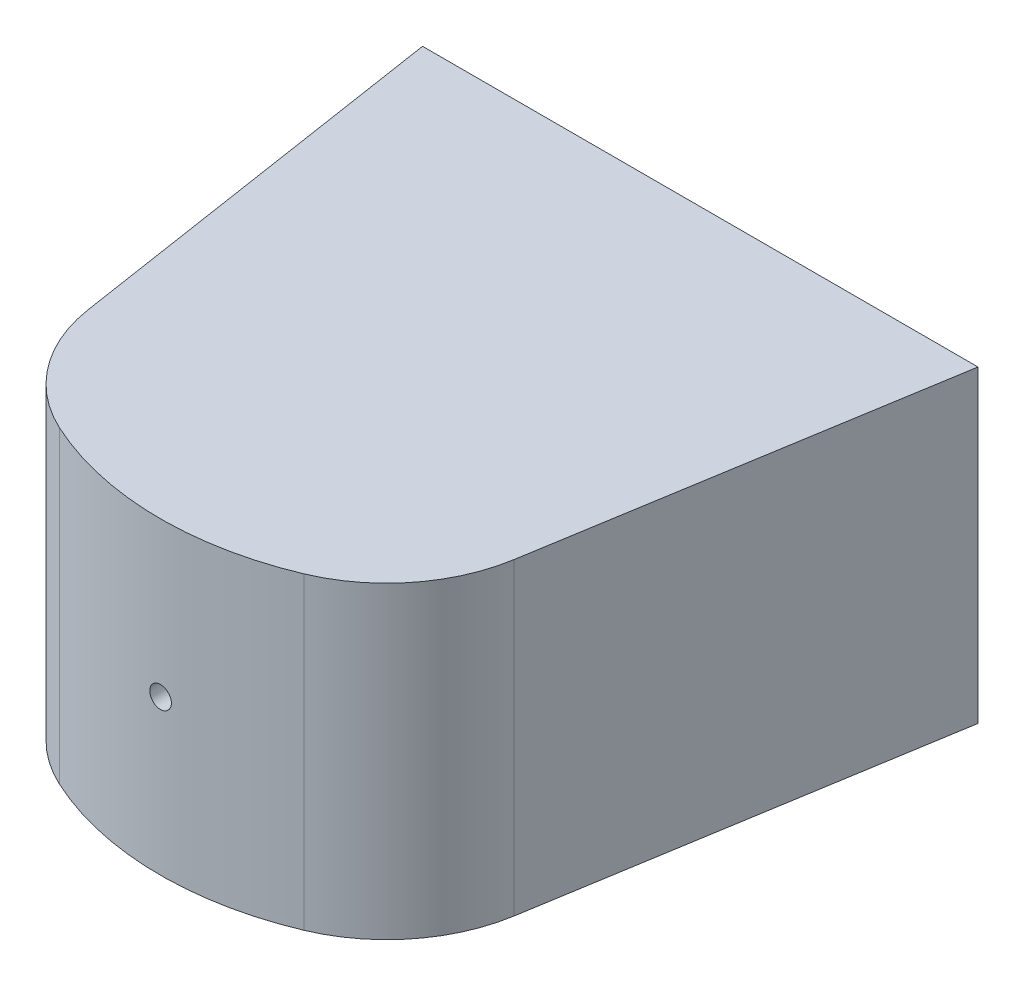
ISO-10303-21;
HEADER;
FILE_DESCRIPTION(('STEP AP214'),'2;1');
FILE_NAME('part.step','',(''),(''),'','','');
FILE_SCHEMA(('AUTOMOTIVE_DESIGN { 1 0 10303 214 1 1 1 1 }'));
ENDSEC;
DATA;
#1=APPLICATION_CONTEXT('core data for automotive mechanical design processes');
#2=APPLICATION_PROTOCOL_DEFINITION('international standard','automotive_design',2000,#1);
#3=PRODUCT_CONTEXT('',#1,'mechanical');
#4=PRODUCT('Part','Part','',(#3));
#5=PRODUCT_RELATED_PRODUCT_CATEGORY('part','',(#4));
#6=PRODUCT_DEFINITION_FORMATION('','',#4);
#7=PRODUCT_DEFINITION_CONTEXT('part definition',#1,'design');
#8=PRODUCT_DEFINITION('design','',#6,#7);
#9=PRODUCT_DEFINITION_SHAPE('','',#8);
#10=(LENGTH_UNIT() NAMED_UNIT(*) SI_UNIT(.MILLI.,.METRE.));
#11=(NAMED_UNIT(*) PLANE_ANGLE_UNIT() SI_UNIT($,.RADIAN.));
#12=(NAMED_UNIT(*) SI_UNIT($,.STERADIAN.) SOLID_ANGLE_UNIT());
#13=UNCERTAINTY_MEASURE_WITH_UNIT(LENGTH_MEASURE(1.E-05),#10,'distance_accuracy_value','');
#14=(GEOMETRIC_REPRESENTATION_CONTEXT(3) GLOBAL_UNCERTAINTY_ASSIGNED_CONTEXT((#13)) GLOBAL_UNIT_ASSIGNED_CONTEXT((#10,
#11,#12)) REPRESENTATION_CONTEXT('',''));
#15=CARTESIAN_POINT('',(0.,0.,0.));
#16=DIRECTION('',(0.,0.,1.));
#17=DIRECTION('',(1.,0.,0.));
#18=AXIS2_PLACEMENT_3D('',#15,#16,#17);
#19=CARTESIAN_POINT('',(0.,10.,15.));
#20=DIRECTION('',(0.,1.,0.));
#21=DIRECTION('',(0.,0.,1.));
#22=AXIS2_PLACEMENT_3D('',#19,#20,#21);
#23=CYLINDRICAL_SURFACE('',#22,20.);
#24=CARTESIAN_POINT('',(0.,10.,15.));
#25=DIRECTION('',(0.,-1.,0.));
#26=DIRECTION('',(0.,0.,-1.));
#27=AXIS2_PLACEMENT_3D('',#24,#25,#26);
#28=CIRCLE('',#27,20.);
#29=CARTESIAN_POINT('',(-8.37400296429082,9.99999999999998,33.1624908631511));
#30=VERTEX_POINT('',#29);
#31=CARTESIAN_POINT('',(7.75362864160863,10.,33.4358683790058));
#32=VERTEX_POINT('',#31);
#33=EDGE_CURVE('E119',#30,#32,#28,.F.);
#34=ORIENTED_EDGE('',*,*,#33,.F.);
#35=DIRECTION('',(0.,1.,0.));
#36=VECTOR('',#35,1.);
#37=CARTESIAN_POINT('',(-8.37400296429082,9.99999999999998,33.1624908631511));
#38=LINE('',#37,#36);
#39=CARTESIAN_POINT('',(-8.37400296429081,-10.,33.1624908631511));
#40=VERTEX_POINT('',#39);
#41=EDGE_CURVE('E48',#30,#40,#38,.F.);
#42=ORIENTED_EDGE('',*,*,#41,.T.);
#43=CARTESIAN_POINT('',(0.,-10.,15.));
#44=DIRECTION('',(0.,1.,0.));
#45=DIRECTION('',(0.,0.,1.));
#46=AXIS2_PLACEMENT_3D('',#43,#44,#45);
#47=CIRCLE('',#46,20.);
#48=CARTESIAN_POINT('',(7.75362864160871,-10.,33.4358683790058));
#49=VERTEX_POINT('',#48);
#50=EDGE_CURVE('E126',#49,#40,#47,.F.);
#51=ORIENTED_EDGE('',*,*,#50,.F.);
#52=DIRECTION('',(0.,1.,0.));
#53=VECTOR('',#52,1.);
#54=CARTESIAN_POINT('',(7.75362864160863,10.,33.4358683790058));
#55=LINE('',#54,#53);
#56=EDGE_CURVE('E132',#49,#32,#55,.T.);
#57=ORIENTED_EDGE('',*,*,#56,.T.);
#58=EDGE_LOOP('',(#34,#42,#51,#57));
#59=FACE_BOUND('',#58,.T.);
#60=CARTESIAN_POINT('',(-0.700000000000006,0.,34.9877462461379));
#61=CARTESIAN_POINT('',(-0.699998260890209,0.0393063852953312,34.9877464113308));
#62=CARTESIAN_POINT('',(-0.696678188889728,0.0786409649358929,34.9878634371996));
#63=CARTESIAN_POINT('',(-0.683480331621821,0.156225942931302,34.9883190027102));
#64=CARTESIAN_POINT('',(-0.673594734762835,0.194474993140245,34.9886578062138));
#65=CARTESIAN_POINT('',(-0.647548388138638,0.268753729919102,34.9895185009882));
#66=CARTESIAN_POINT('',(-0.631390734444219,0.30478450134505,34.990040301914));
#67=CARTESIAN_POINT('',(-0.593263436017411,0.373612257738698,34.991208079844));
#68=CARTESIAN_POINT('',(-0.571295200525028,0.406410024162923,34.9918540267289));
#69=CARTESIAN_POINT('',(-0.522155938660528,0.467869454320733,34.9931977377068));
#70=CARTESIAN_POINT('',(-0.494982381880045,0.496529094497943,34.9938955269));
#71=CARTESIAN_POINT('',(-0.436208483184136,0.548881625183902,34.9952640488424));
#72=CARTESIAN_POINT('',(-0.404607964177691,0.572574316905954,34.9959347805077));
#73=CARTESIAN_POINT('',(-0.337868545784302,0.614324428663613,34.9971737337277));
#74=CARTESIAN_POINT('',(-0.302728805605318,0.63238050544536,34.997741930834));
#75=CARTESIAN_POINT('',(-0.229914399000482,0.662336149497862,34.998711552155));
#76=CARTESIAN_POINT('',(-0.192239744568141,0.674235745894631,34.9991129771588));
#77=CARTESIAN_POINT('',(-0.115441436559457,0.691535937457068,34.999703658983));
#78=CARTESIAN_POINT('',(-0.0763183880957933,0.696939215776175,34.9998930033961));
#79=CARTESIAN_POINT('',(0.00227987332142793,0.701101662857244,35.0000384752745));
#80=CARTESIAN_POINT('',(0.0417550845914045,0.69986086336551,34.9999946038541));
#81=CARTESIAN_POINT('',(0.11991894284773,0.690772628659084,34.9996786636709));
#82=CARTESIAN_POINT('',(0.158607926723537,0.682928086926541,34.9994066948509));
#83=CARTESIAN_POINT('',(0.234119530699298,0.660859524337322,34.9986653229899));
#84=CARTESIAN_POINT('',(0.270942145935487,0.646635486856598,34.9981959194343));
#85=CARTESIAN_POINT('',(0.341685069450775,0.61220838553029,34.9971124041139));
#86=CARTESIAN_POINT('',(0.375604732664675,0.592003997214554,34.9964982602996));
#87=CARTESIAN_POINT('',(0.439571829070555,0.546190701946185,34.9951944667406));
#88=CARTESIAN_POINT('',(0.469619249653159,0.520581777395207,34.9945048167501));
#89=CARTESIAN_POINT('',(0.525005792951096,0.464669979802895,34.993127284024));
#90=CARTESIAN_POINT('',(0.550342381609461,0.434364596413453,34.9924394024347));
#91=CARTESIAN_POINT('',(0.595568536298639,0.369928986937189,34.9911433306044));
#92=CARTESIAN_POINT('',(0.61545810134382,0.335798760158268,34.9905351403778));
#93=CARTESIAN_POINT('',(0.649225351928819,0.264680850668366,34.9894670577595));
#94=CARTESIAN_POINT('',(0.663102952637013,0.227693127645458,34.9890071674603));
#95=CARTESIAN_POINT('',(0.68445069614479,0.151910828676057,34.9882876280343));
#96=CARTESIAN_POINT('',(0.691920862636908,0.113116259411232,34.988027978167));
#97=CARTESIAN_POINT('',(0.700238572465638,0.0348435584012891,34.9877383322723));
#98=CARTESIAN_POINT('',(0.701089627838652,-0.0046341997042477,34.9877082144575));
#99=CARTESIAN_POINT('',(0.696154111887871,-0.0831720175873061,34.9878807109631));
#100=CARTESIAN_POINT('',(0.69036755114678,-0.122232078030685,34.9880833249124));
#101=CARTESIAN_POINT('',(0.672323972057012,-0.198815913207865,34.9886983341083));
#102=CARTESIAN_POINT('',(0.660068552079856,-0.236340064977974,34.9891106775327));
#103=CARTESIAN_POINT('',(0.629436761352983,-0.308798492297642,34.9900986199087));
#104=CARTESIAN_POINT('',(0.611060373573136,-0.343732760641138,34.9906742193145));
#105=CARTESIAN_POINT('',(0.568699242066675,-0.41003593702497,34.9919240860476));
#106=CARTESIAN_POINT('',(0.544712134172346,-0.441403333803063,34.9925983949226));
#107=CARTESIAN_POINT('',(0.491813936506222,-0.499667176203338,34.9939695211422));
#108=CARTESIAN_POINT('',(0.462902830335708,-0.526563606934974,34.9946663385617));
#109=CARTESIAN_POINT('',(0.400962266501224,-0.575133762921623,34.9960042871362));
#110=CARTESIAN_POINT('',(0.3679310318411,-0.596805222765503,34.9966453940598));
#111=CARTESIAN_POINT('',(0.298696892751719,-0.634294777296684,34.9977993103075));
#112=CARTESIAN_POINT('',(0.262493996829088,-0.650112887682498,34.9983121199758));
#113=CARTESIAN_POINT('',(0.187952720918064,-0.675442752249843,34.9991515215488));
#114=CARTESIAN_POINT('',(0.149614838858052,-0.684955970256943,34.9994781566757));
#115=CARTESIAN_POINT('',(0.0718848296507417,-0.697410803378236,34.9999085623343));
#116=CARTESIAN_POINT('',(0.0324927044466741,-0.700352430604655,35.0000123332767));
#117=CARTESIAN_POINT('',(-0.0462049964990721,-0.69958041545713,34.9999853163912));
#118=CARTESIAN_POINT('',(-0.0855106073017713,-0.695870337618251,34.9998546541919));
#119=CARTESIAN_POINT('',(-0.162940673973917,-0.681907569314676,34.9993737378771));
#120=CARTESIAN_POINT('',(-0.201065127523341,-0.671654865999852,34.9990234833303));
#121=CARTESIAN_POINT('',(-0.275051802590233,-0.644898463288418,34.9981428246583));
#122=CARTESIAN_POINT('',(-0.310913989231024,-0.628394667548092,34.9976124177566));
#123=CARTESIAN_POINT('',(-0.379358052996995,-0.589605540876108,34.9964311951171));
#124=CARTESIAN_POINT('',(-0.411940045040623,-0.567320412585759,34.9957803835997));
#125=CARTESIAN_POINT('',(-0.472915805207999,-0.517589779381324,34.9944312953351));
#126=CARTESIAN_POINT('',(-0.501307770692091,-0.490142064894872,34.9937329983461));
#127=CARTESIAN_POINT('',(-0.553088761470682,-0.430861709763118,34.9923676861932));
#128=CARTESIAN_POINT('',(-0.576476547859615,-0.399027986454668,34.9917006788076));
#129=CARTESIAN_POINT('',(-0.617590668992262,-0.331864265112787,34.9904728924714));
#130=CARTESIAN_POINT('',(-0.635312966878493,-0.29653179747678,34.9899121893815));
#131=CARTESIAN_POINT('',(-0.664553231308031,-0.223418078000421,34.9889615800812));
#132=CARTESIAN_POINT('',(-0.676078582139871,-0.185639801030183,34.9885714706951));
#133=CARTESIAN_POINT('',(-0.689549786453719,-0.123019723613056,34.9881101196472));
#134=CARTESIAN_POINT('',(-0.693463670963585,-0.0985842123045261,34.9879742617171));
#135=CARTESIAN_POINT('',(-0.698689324158503,-0.0494361855215801,34.9877922730275));
#136=CARTESIAN_POINT('',(-0.700001093898025,-0.0247236701594202,34.9877461422318));
#137=CARTESIAN_POINT('',(-0.700000000000006,0.,34.9877462461379));
#138=B_SPLINE_CURVE_WITH_KNOTS('',3,(#60,#61,#62,#63,#64,#65,#66,#67,#68,#69,#70,#71,#72,#73,
#74,#75,#76,#77,#78,#79,#80,#81,#82,#83,#84,#85,#86,#87,#88,#89,#90,#91,#92,#93,#94,#95,#96,#97,
#98,#99,#100,#101,#102,#103,#104,#105,#106,#107,#108,#109,#110,#111,#112,#113,#114,#115,#116,
#117,#118,#119,#120,#121,#122,#123,#124,#125,#126,#127,#128,#129,#130,#131,#132,#133,#134,#135,
#136,#137),.UNSPECIFIED.,.T.,.F.,(4,2,2,2,2,2,2,2,2,2,2,2,2,2,2,2,2,2,2,2,2,2,2,2,2,2,2,2,2,2,2,
2,2,2,2,2,2,2,4),(0.,0.11782890999564,0.235798263321886,0.353709457424264,0.471592080712889,
0.589532155142399,0.707476948856605,0.825449828411505,0.943422149837264,1.06134572877582,
1.17926874426006,1.29714011771453,1.41501179832662,1.53290960357384,1.65080779272787,
1.76876921950107,1.88673066761924,2.00469378017428,2.12265645653954,2.24055653877575,
2.35845643303786,2.47632720938717,2.59419831368652,2.71211917464068,2.83004042832221,
2.94801271800934,3.06598469129591,3.18392926507534,3.30187362146867,3.41975479238747,
3.53763619483306,3.6555194141762,3.7733985021564,3.8913281573345,4.00928697515491,
4.12732965635779,4.24523136428497,4.31934564023801,4.3934598861573),.UNSPECIFIED.);
#139=CARTESIAN_POINT('',(-0.700000000000006,0.,34.9877462461379));
#140=VERTEX_POINT('',#139);
#141=EDGE_CURVE('E38',#140,#140,#138,.T.);
#142=ORIENTED_EDGE('',*,*,#141,.T.);
#143=EDGE_LOOP('',(#142));
#144=FACE_BOUND('',#143,.T.);
#145=ADVANCED_FACE('F34',(#59,#144),#23,.T.);
#146=CARTESIAN_POINT('',(-20.,10.0000000000001,35.));
#147=DIRECTION('',(0.,-1.,0.));
#148=DIRECTION('',(0.,0.,-1.));
#149=AXIS2_PLACEMENT_3D('',#146,#147,#148);
#150=PLANE('',#149);
#151=DIRECTION('',(-0.152281555289712,0.,-0.988337152958719));
#152=VECTOR('',#151,1.);
#153=CARTESIAN_POINT('',(-12.6246080691139,9.99999999999998,34.9873589453902));
#154=LINE('',#153,#152);
#155=CARTESIAN_POINT('',(-14.0703730117326,9.99999999999998,25.6040609844727));
#156=VERTEX_POINT('',#155);
#157=CARTESIAN_POINT('',(-18.015409598464,10.0000000000001,0.));
#158=VERTEX_POINT('',#157);
#159=EDGE_CURVE('E121',#156,#158,#154,.T.);
#160=ORIENTED_EDGE('',*,*,#159,.F.);
#161=CARTESIAN_POINT('',(-4.18700148214539,10.,24.0812454315756));
#162=DIRECTION('',(0.,-1.,0.));
#163=DIRECTION('',(0.,0.,-1.));
#164=AXIS2_PLACEMENT_3D('',#161,#162,#163);
#165=CIRCLE('',#164,10.);
#166=EDGE_CURVE('E62',#156,#30,#165,.F.);
#167=ORIENTED_EDGE('',*,*,#166,.T.);
#168=ORIENTED_EDGE('',*,*,#33,.T.);
#169=CARTESIAN_POINT('',(3.87681432080435,10.,24.2179341895029));
#170=DIRECTION('',(0.,-1.,0.));
#171=DIRECTION('',(0.,0.,-1.));
#172=AXIS2_PLACEMENT_3D('',#169,#170,#171);
#173=CIRCLE('',#172,10.);
#174=CARTESIAN_POINT('',(13.7457775240337,10.,25.8314909109434));
#175=VERTEX_POINT('',#174);
#176=EDGE_CURVE('E112',#32,#175,#173,.F.);
#177=ORIENTED_EDGE('',*,*,#176,.T.);
#178=DIRECTION('',(-0.161355672144053,0.,0.986896320322931));
#179=VECTOR('',#178,1.);
#180=CARTESIAN_POINT('',(11.9569461720083,10.,36.7724826686801));
#181=LINE('',#180,#179);
#182=CARTESIAN_POINT('',(17.9691771786748,10.,-1.66533453693773E-13));
#183=VERTEX_POINT('',#182);
#184=EDGE_CURVE('E96',#183,#175,#181,.T.);
#185=ORIENTED_EDGE('',*,*,#184,.F.);
#186=DIRECTION('',(-1.,0.,0.));
#187=VECTOR('',#186,1.);
#188=CARTESIAN_POINT('',(-20.,10.0000000000001,0.));
#189=LINE('',#188,#187);
#190=EDGE_CURVE('E109',#183,#158,#189,.T.);
#191=ORIENTED_EDGE('',*,*,#190,.T.);
#192=EDGE_LOOP('',(#160,#167,#168,#177,#185,#191));
#193=FACE_BOUND('',#192,.T.);
#194=ADVANCED_FACE('F108',(#193),#150,.F.);
#195=CARTESIAN_POINT('',(-20.,-9.99999999999984,35.));
#196=DIRECTION('',(0.,1.,0.));
#197=DIRECTION('',(0.,0.,1.));
#198=AXIS2_PLACEMENT_3D('',#195,#196,#197);
#199=PLANE('',#198);
#200=ORIENTED_EDGE('',*,*,#50,.T.);
#201=CARTESIAN_POINT('',(-4.18700148214539,-10.,24.0812454315756));
#202=DIRECTION('',(0.,1.,0.));
#203=DIRECTION('',(0.,0.,1.));
#204=AXIS2_PLACEMENT_3D('',#201,#202,#203);
#205=CIRCLE('',#204,10.);
#206=CARTESIAN_POINT('',(-14.0703730117326,-10.,25.6040609844727));
#207=VERTEX_POINT('',#206);
#208=EDGE_CURVE('E11',#40,#207,#205,.F.);
#209=ORIENTED_EDGE('',*,*,#208,.T.);
#210=DIRECTION('',(-0.152281555289712,0.,-0.988337152958719));
#211=VECTOR('',#210,1.);
#212=CARTESIAN_POINT('',(-12.6246080691139,-10.,34.9873589453902));
#213=LINE('',#212,#211);
#214=CARTESIAN_POINT('',(-18.015409598464,-9.99999999999984,0.));
#215=VERTEX_POINT('',#214);
#216=EDGE_CURVE('E117',#207,#215,#213,.T.);
#217=ORIENTED_EDGE('',*,*,#216,.T.);
#218=DIRECTION('',(1.,0.,0.));
#219=VECTOR('',#218,1.);
#220=CARTESIAN_POINT('',(-20.,-9.99999999999984,0.));
#221=LINE('',#220,#219);
#222=CARTESIAN_POINT('',(17.9691771786746,-9.99999999999998,-1.66533453693773E-13));
#223=VERTEX_POINT('',#222);
#224=EDGE_CURVE('E116',#215,#223,#221,.T.);
#225=ORIENTED_EDGE('',*,*,#224,.T.);
#226=DIRECTION('',(-0.161355672144053,0.,0.986896320322931));
#227=VECTOR('',#226,1.);
#228=CARTESIAN_POINT('',(11.9569461720083,-10.,36.7724826686801));
#229=LINE('',#228,#227);
#230=CARTESIAN_POINT('',(13.7457775240337,-10.,25.8314909109434));
#231=VERTEX_POINT('',#230);
#232=EDGE_CURVE('E99',#223,#231,#229,.T.);
#233=ORIENTED_EDGE('',*,*,#232,.T.);
#234=CARTESIAN_POINT('',(3.87681432080438,-10.,24.2179341895029));
#235=DIRECTION('',(0.,1.,0.));
#236=DIRECTION('',(0.,0.,1.));
#237=AXIS2_PLACEMENT_3D('',#234,#235,#236);
#238=CIRCLE('',#237,10.);
#239=EDGE_CURVE('E130',#231,#49,#238,.F.);
#240=ORIENTED_EDGE('',*,*,#239,.T.);
#241=EDGE_LOOP('',(#200,#209,#217,#225,#233,#240));
#242=FACE_BOUND('',#241,.T.);
#243=ADVANCED_FACE('F179',(#242),#199,.F.);
#244=CARTESIAN_POINT('',(0.,0.,0.));
#245=DIRECTION('',(0.,0.,1.));
#246=DIRECTION('',(1.,0.,0.));
#247=AXIS2_PLACEMENT_3D('',#244,#245,#246);
#248=PLANE('',#247);
#249=CARTESIAN_POINT('',(-5.,0.,0.));
#250=DIRECTION('',(0.,0.,1.));
#251=DIRECTION('',(1.,0.,0.));
#252=AXIS2_PLACEMENT_3D('',#249,#250,#251);
#253=CIRCLE('',#252,0.5);
#254=CARTESIAN_POINT('',(-4.5,0.,0.));
#255=VERTEX_POINT('',#254);
#256=EDGE_CURVE('E158',#255,#255,#253,.T.);
#257=ORIENTED_EDGE('',*,*,#256,.T.);
#258=EDGE_LOOP('',(#257));
#259=FACE_BOUND('',#258,.T.);
#260=CARTESIAN_POINT('',(5.,0.,0.));
#261=DIRECTION('',(0.,0.,1.));
#262=DIRECTION('',(-1.,0.,0.));
#263=AXIS2_PLACEMENT_3D('',#260,#261,#262);
#264=CIRCLE('',#263,0.5);
#265=CARTESIAN_POINT('',(4.5,0.,0.));
#266=VERTEX_POINT('',#265);
#267=EDGE_CURVE('E152',#266,#266,#264,.T.);
#268=ORIENTED_EDGE('',*,*,#267,.T.);
#269=EDGE_LOOP('',(#268));
#270=FACE_BOUND('',#269,.T.);
#271=ORIENTED_EDGE('',*,*,#190,.F.);
#272=DIRECTION('',(0.,-1.,0.));
#273=VECTOR('',#272,1.);
#274=CARTESIAN_POINT('',(17.9691771786746,0.,-1.66533453693773E-13));
#275=LINE('',#274,#273);
#276=EDGE_CURVE('E92',#183,#223,#275,.T.);
#277=ORIENTED_EDGE('',*,*,#276,.T.);
#278=ORIENTED_EDGE('',*,*,#224,.F.);
#279=DIRECTION('',(0.,1.,0.));
#280=VECTOR('',#279,1.);
#281=CARTESIAN_POINT('',(-18.015409598464,1.66533453693773E-13,0.));
#282=LINE('',#281,#280);
#283=EDGE_CURVE('E105',#215,#158,#282,.T.);
#284=ORIENTED_EDGE('',*,*,#283,.T.);
#285=EDGE_LOOP('',(#271,#277,#278,#284));
#286=FACE_BOUND('',#285,.T.);
#287=ADVANCED_FACE('F114',(#259,#270,#286),#248,.F.);
#288=CARTESIAN_POINT('',(-12.6246080691139,-10.,34.9873589453902));
#289=DIRECTION('',(0.988337152958719,0.,-0.152281555289712));
#290=DIRECTION('',(-0.152281555289712,0.,-0.988337152958719));
#291=AXIS2_PLACEMENT_3D('',#288,#289,#290);
#292=PLANE('',#291);
#293=ORIENTED_EDGE('',*,*,#216,.F.);
#294=DIRECTION('',(0.,-1.,0.));
#295=VECTOR('',#294,1.);
#296=CARTESIAN_POINT('',(-14.0703730117326,9.99999999999998,25.6040609844727));
#297=LINE('',#296,#295);
#298=EDGE_CURVE('E136',#207,#156,#297,.F.);
#299=ORIENTED_EDGE('',*,*,#298,.T.);
#300=ORIENTED_EDGE('',*,*,#159,.T.);
#301=ORIENTED_EDGE('',*,*,#283,.F.);
#302=EDGE_LOOP('',(#293,#299,#300,#301));
#303=FACE_BOUND('',#302,.T.);
#304=ADVANCED_FACE('F143',(#303),#292,.F.);
#305=CARTESIAN_POINT('',(11.9569461720083,-10.,36.7724826686801));
#306=DIRECTION('',(-0.986896320322931,0.,-0.161355672144053));
#307=DIRECTION('',(-0.161355672144053,0.,0.986896320322931));
#308=AXIS2_PLACEMENT_3D('',#305,#306,#307);
#309=PLANE('',#308);
#310=ORIENTED_EDGE('',*,*,#184,.T.);
#311=DIRECTION('',(0.,-1.,0.));
#312=VECTOR('',#311,1.);
#313=CARTESIAN_POINT('',(13.7457775240337,-10.,25.8314909109434));
#314=LINE('',#313,#312);
#315=EDGE_CURVE('E104',#175,#231,#314,.T.);
#316=ORIENTED_EDGE('',*,*,#315,.T.);
#317=ORIENTED_EDGE('',*,*,#232,.F.);
#318=ORIENTED_EDGE('',*,*,#276,.F.);
#319=EDGE_LOOP('',(#310,#316,#317,#318));
#320=FACE_BOUND('',#319,.T.);
#321=ADVANCED_FACE('F94',(#320),#309,.F.);
#322=CARTESIAN_POINT('',(3.87681432080435,10.,24.2179341895029));
#323=DIRECTION('',(0.,1.,0.));
#324=DIRECTION('',(0.,0.,1.));
#325=AXIS2_PLACEMENT_3D('',#322,#323,#324);
#326=CYLINDRICAL_SURFACE('',#325,10.);
#327=ORIENTED_EDGE('',*,*,#176,.F.);
#328=ORIENTED_EDGE('',*,*,#56,.F.);
#329=ORIENTED_EDGE('',*,*,#239,.F.);
#330=ORIENTED_EDGE('',*,*,#315,.F.);
#331=EDGE_LOOP('',(#327,#328,#329,#330));
#332=FACE_BOUND('',#331,.T.);
#333=ADVANCED_FACE('F187',(#332),#326,.T.);
#334=CARTESIAN_POINT('',(-4.18700148214539,10.,24.0812454315756));
#335=DIRECTION('',(0.,1.,0.));
#336=DIRECTION('',(0.,0.,1.));
#337=AXIS2_PLACEMENT_3D('',#334,#335,#336);
#338=CYLINDRICAL_SURFACE('',#337,10.);
#339=ORIENTED_EDGE('',*,*,#208,.F.);
#340=ORIENTED_EDGE('',*,*,#41,.F.);
#341=ORIENTED_EDGE('',*,*,#166,.F.);
#342=ORIENTED_EDGE('',*,*,#298,.F.);
#343=EDGE_LOOP('',(#339,#340,#341,#342));
#344=FACE_BOUND('',#343,.T.);
#345=ADVANCED_FACE('F36',(#344),#338,.T.);
#346=CARTESIAN_POINT('',(0.,0.,68.));
#347=DIRECTION('',(0.,0.,-1.));
#348=DIRECTION('',(-1.,0.,0.));
#349=AXIS2_PLACEMENT_3D('',#346,#347,#348);
#350=CYLINDRICAL_SURFACE('',#349,0.7);
#351=ORIENTED_EDGE('',*,*,#141,.F.);
#352=EDGE_LOOP('',(#351));
#353=FACE_BOUND('',#352,.T.);
#354=CARTESIAN_POINT('',(0.,0.,33.));
#355=DIRECTION('',(0.,0.,1.));
#356=DIRECTION('',(1.,0.,0.));
#357=AXIS2_PLACEMENT_3D('',#354,#355,#356);
#358=CIRCLE('',#357,0.7);
#359=CARTESIAN_POINT('',(0.7,0.,33.));
#360=VERTEX_POINT('',#359);
#361=EDGE_CURVE('E148',#360,#360,#358,.T.);
#362=ORIENTED_EDGE('',*,*,#361,.F.);
#363=EDGE_LOOP('',(#362));
#364=FACE_BOUND('',#363,.T.);
#365=ADVANCED_FACE('F194',(#353,#364),#350,.F.);
#366=CARTESIAN_POINT('',(0.,0.,33.));
#367=DIRECTION('',(0.,0.,1.));
#368=DIRECTION('',(1.,0.,0.));
#369=AXIS2_PLACEMENT_3D('',#366,#367,#368);
#370=PLANE('',#369);
#371=ORIENTED_EDGE('',*,*,#361,.T.);
#372=EDGE_LOOP('',(#371));
#373=FACE_BOUND('',#372,.T.);
#374=ADVANCED_FACE('F209',(#373),#370,.T.);
#375=CARTESIAN_POINT('',(5.,0.,5.));
#376=DIRECTION('',(0.,0.,-1.));
#377=DIRECTION('',(-1.,0.,0.));
#378=AXIS2_PLACEMENT_3D('',#375,#376,#377);
#379=CYLINDRICAL_SURFACE('',#378,0.5);
#380=CARTESIAN_POINT('',(5.,0.,5.));
#381=DIRECTION('',(0.,0.,1.));
#382=DIRECTION('',(-1.,0.,0.));
#383=AXIS2_PLACEMENT_3D('',#380,#381,#382);
#384=CIRCLE('',#383,0.5);
#385=CARTESIAN_POINT('',(4.5,0.,5.));
#386=VERTEX_POINT('',#385);
#387=EDGE_CURVE('E155',#386,#386,#384,.T.);
#388=ORIENTED_EDGE('',*,*,#387,.T.);
#389=EDGE_LOOP('',(#388));
#390=FACE_BOUND('',#389,.T.);
#391=ORIENTED_EDGE('',*,*,#267,.F.);
#392=EDGE_LOOP('',(#391));
#393=FACE_BOUND('',#392,.T.);
#394=ADVANCED_FACE('F213',(#390,#393),#379,.F.);
#395=CARTESIAN_POINT('',(5.,0.,5.));
#396=DIRECTION('',(0.,0.,-1.));
#397=DIRECTION('',(-1.,0.,0.));
#398=AXIS2_PLACEMENT_3D('',#395,#396,#397);
#399=PLANE('',#398);
#400=ORIENTED_EDGE('',*,*,#387,.F.);
#401=EDGE_LOOP('',(#400));
#402=FACE_BOUND('',#401,.T.);
#403=ADVANCED_FACE('F173',(#402),#399,.T.);
#404=CARTESIAN_POINT('',(-5.,0.,5.));
#405=DIRECTION('',(0.,0.,-1.));
#406=DIRECTION('',(-1.,0.,0.));
#407=AXIS2_PLACEMENT_3D('',#404,#405,#406);
#408=CYLINDRICAL_SURFACE('',#407,0.5);
#409=CARTESIAN_POINT('',(-5.,0.,5.));
#410=DIRECTION('',(0.,0.,1.));
#411=DIRECTION('',(1.,0.,0.));
#412=AXIS2_PLACEMENT_3D('',#409,#410,#411);
#413=CIRCLE('',#412,0.5);
#414=CARTESIAN_POINT('',(-4.5,0.,5.));
#415=VERTEX_POINT('',#414);
#416=EDGE_CURVE('E151',#415,#415,#413,.T.);
#417=ORIENTED_EDGE('',*,*,#416,.T.);
#418=EDGE_LOOP('',(#417));
#419=FACE_BOUND('',#418,.T.);
#420=ORIENTED_EDGE('',*,*,#256,.F.);
#421=EDGE_LOOP('',(#420));
#422=FACE_BOUND('',#421,.T.);
#423=ADVANCED_FACE('F164',(#419,#422),#408,.F.);
#424=CARTESIAN_POINT('',(-5.,0.,5.));
#425=DIRECTION('',(0.,0.,1.));
#426=DIRECTION('',(1.,0.,0.));
#427=AXIS2_PLACEMENT_3D('',#424,#425,#426);
#428=PLANE('',#427);
#429=ORIENTED_EDGE('',*,*,#416,.F.);
#430=EDGE_LOOP('',(#429));
#431=FACE_BOUND('',#430,.T.);
#432=ADVANCED_FACE('F167',(#431),#428,.F.);
#433=CLOSED_SHELL('',(#145,#194,#243,#287,#304,#321,#333,#345,#365,#374,#394,#403,#423,#432));
#434=MANIFOLD_SOLID_BREP('B2',#433);
#435=ADVANCED_BREP_SHAPE_REPRESENTATION('',(#18,#434),#14);
#436=SHAPE_DEFINITION_REPRESENTATION(#9,#435);
ENDSEC;
END-ISO-10303-21;
